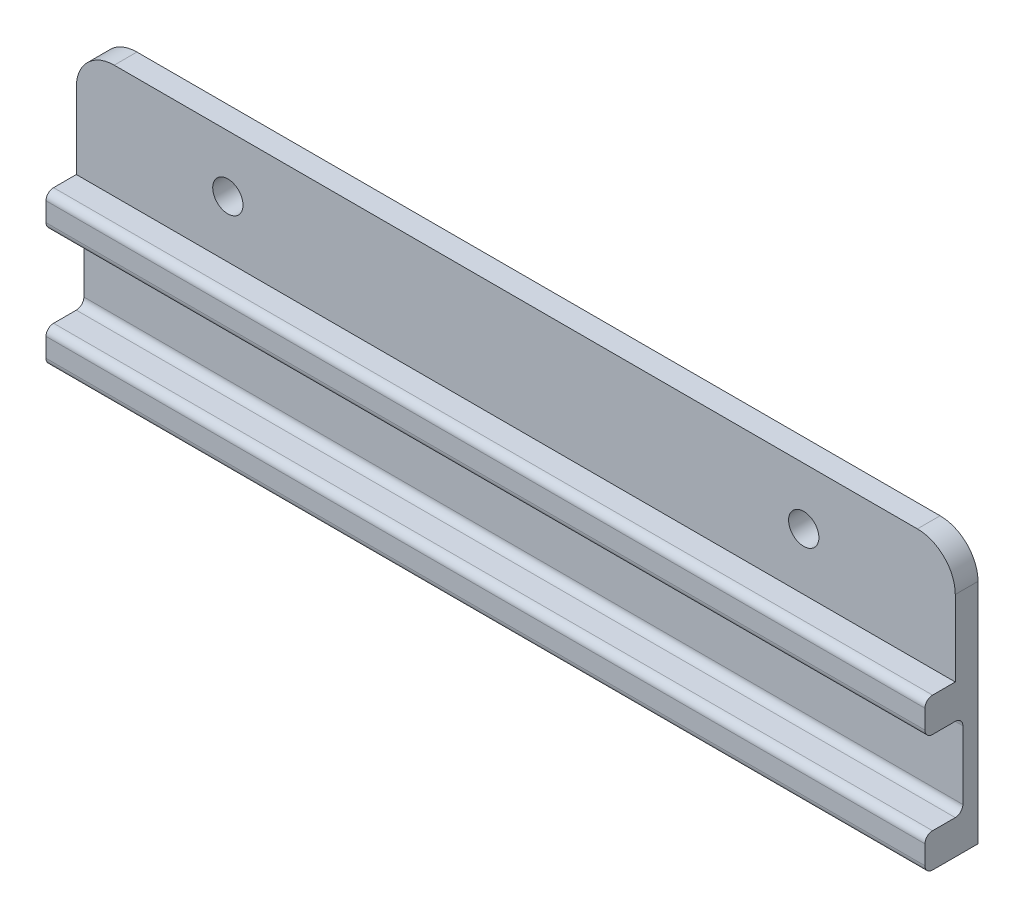
ISO-10303-21;
HEADER;
FILE_DESCRIPTION(('STEP AP214'),'2;1');
FILE_NAME('part.step','',(''),(''),'','','');
FILE_SCHEMA(('AUTOMOTIVE_DESIGN { 1 0 10303 214 1 1 1 1 }'));
ENDSEC;
DATA;
#1=APPLICATION_CONTEXT('core data for automotive mechanical design processes');
#2=APPLICATION_PROTOCOL_DEFINITION('international standard','automotive_design',2000,#1);
#3=PRODUCT_CONTEXT('',#1,'mechanical');
#4=PRODUCT('Part','Part','',(#3));
#5=PRODUCT_RELATED_PRODUCT_CATEGORY('part','',(#4));
#6=PRODUCT_DEFINITION_FORMATION('','',#4);
#7=PRODUCT_DEFINITION_CONTEXT('part definition',#1,'design');
#8=PRODUCT_DEFINITION('design','',#6,#7);
#9=PRODUCT_DEFINITION_SHAPE('','',#8);
#10=(LENGTH_UNIT() NAMED_UNIT(*) SI_UNIT(.MILLI.,.METRE.));
#11=(NAMED_UNIT(*) PLANE_ANGLE_UNIT() SI_UNIT($,.RADIAN.));
#12=(NAMED_UNIT(*) SI_UNIT($,.STERADIAN.) SOLID_ANGLE_UNIT());
#13=UNCERTAINTY_MEASURE_WITH_UNIT(LENGTH_MEASURE(1.E-05),#10,'distance_accuracy_value','');
#14=(GEOMETRIC_REPRESENTATION_CONTEXT(3) GLOBAL_UNCERTAINTY_ASSIGNED_CONTEXT((#13)) GLOBAL_UNIT_ASSIGNED_CONTEXT((#10,
#11,#12)) REPRESENTATION_CONTEXT('',''));
#15=CARTESIAN_POINT('',(0.,0.,0.));
#16=DIRECTION('',(0.,0.,1.));
#17=DIRECTION('',(1.,0.,0.));
#18=AXIS2_PLACEMENT_3D('',#15,#16,#17);
#19=CARTESIAN_POINT('',(0.,20.,2.));
#20=DIRECTION('',(0.,-1.,0.));
#21=DIRECTION('',(0.,0.,-1.));
#22=AXIS2_PLACEMENT_3D('',#19,#20,#21);
#23=PLANE('',#22);
#24=DIRECTION('',(1.,0.,0.));
#25=VECTOR('',#24,1.);
#26=CARTESIAN_POINT('',(0.,20.,3.));
#27=LINE('',#26,#25);
#28=CARTESIAN_POINT('',(0.,20.,3.));
#29=VERTEX_POINT('',#28);
#30=CARTESIAN_POINT('',(116.,20.,3.));
#31=VERTEX_POINT('',#30);
#32=EDGE_CURVE('E278',#29,#31,#27,.T.);
#33=ORIENTED_EDGE('',*,*,#32,.F.);
#34=DIRECTION('',(0.,0.,-1.));
#35=VECTOR('',#34,1.);
#36=CARTESIAN_POINT('',(0.,20.,2.));
#37=LINE('',#36,#35);
#38=CARTESIAN_POINT('',(0.,20.,6.));
#39=VERTEX_POINT('',#38);
#40=EDGE_CURVE('E194',#39,#29,#37,.T.);
#41=ORIENTED_EDGE('',*,*,#40,.F.);
#42=DIRECTION('',(-1.,0.,0.));
#43=VECTOR('',#42,1.);
#44=CARTESIAN_POINT('',(116.,20.,6.));
#45=LINE('',#44,#43);
#46=CARTESIAN_POINT('',(116.,20.,6.));
#47=VERTEX_POINT('',#46);
#48=EDGE_CURVE('E229',#39,#47,#45,.F.);
#49=ORIENTED_EDGE('',*,*,#48,.T.);
#50=DIRECTION('',(0.,0.,-1.));
#51=VECTOR('',#50,1.);
#52=CARTESIAN_POINT('',(116.,20.,2.));
#53=LINE('',#52,#51);
#54=EDGE_CURVE('E197',#47,#31,#53,.T.);
#55=ORIENTED_EDGE('',*,*,#54,.T.);
#56=EDGE_LOOP('',(#33,#41,#49,#55));
#57=FACE_BOUND('',#56,.T.);
#58=ADVANCED_FACE('F39',(#57),#23,.F.);
#59=CARTESIAN_POINT('',(0.,0.,2.));
#60=DIRECTION('',(0.,0.,-1.));
#61=DIRECTION('',(-1.,0.,0.));
#62=AXIS2_PLACEMENT_3D('',#59,#60,#61);
#63=PLANE('',#62);
#64=DIRECTION('',(0.,-1.,0.));
#65=VECTOR('',#64,1.);
#66=CARTESIAN_POINT('',(0.,0.,2.));
#67=LINE('',#66,#65);
#68=CARTESIAN_POINT('',(0.,14.5,2.));
#69=VERTEX_POINT('',#68);
#70=CARTESIAN_POINT('',(0.,5.5,2.));
#71=VERTEX_POINT('',#70);
#72=EDGE_CURVE('E190',#69,#71,#67,.T.);
#73=ORIENTED_EDGE('',*,*,#72,.T.);
#74=DIRECTION('',(-1.,0.,0.));
#75=VECTOR('',#74,1.);
#76=CARTESIAN_POINT('',(116.,5.5,2.));
#77=LINE('',#76,#75);
#78=CARTESIAN_POINT('',(116.,5.5,2.));
#79=VERTEX_POINT('',#78);
#80=EDGE_CURVE('E208',#71,#79,#77,.F.);
#81=ORIENTED_EDGE('',*,*,#80,.T.);
#82=DIRECTION('',(0.,1.,0.));
#83=VECTOR('',#82,1.);
#84=CARTESIAN_POINT('',(116.,0.,2.));
#85=LINE('',#84,#83);
#86=CARTESIAN_POINT('',(116.,14.5,2.));
#87=VERTEX_POINT('',#86);
#88=EDGE_CURVE('E198',#79,#87,#85,.T.);
#89=ORIENTED_EDGE('',*,*,#88,.T.);
#90=DIRECTION('',(1.,0.,0.));
#91=VECTOR('',#90,1.);
#92=CARTESIAN_POINT('',(0.,14.5,2.));
#93=LINE('',#92,#91);
#94=EDGE_CURVE('E206',#87,#69,#93,.F.);
#95=ORIENTED_EDGE('',*,*,#94,.T.);
#96=EDGE_LOOP('',(#73,#81,#89,#95));
#97=FACE_BOUND('',#96,.T.);
#98=ADVANCED_FACE('F315',(#97),#63,.F.);
#99=CARTESIAN_POINT('',(0.,0.,2.));
#100=DIRECTION('',(1.,0.,0.));
#101=DIRECTION('',(0.,0.,-1.));
#102=AXIS2_PLACEMENT_3D('',#99,#100,#101);
#103=PLANE('',#102);
#104=DIRECTION('',(0.,-1.,0.));
#105=VECTOR('',#104,1.);
#106=CARTESIAN_POINT('',(0.,35.,3.));
#107=LINE('',#106,#105);
#108=CARTESIAN_POINT('',(0.,30.,3.));
#109=VERTEX_POINT('',#108);
#110=EDGE_CURVE('E353',#109,#29,#107,.T.);
#111=ORIENTED_EDGE('',*,*,#110,.F.);
#112=DIRECTION('',(0.,0.,1.));
#113=VECTOR('',#112,1.);
#114=CARTESIAN_POINT('',(0.,30.,0.));
#115=LINE('',#114,#113);
#116=CARTESIAN_POINT('',(0.,30.,0.));
#117=VERTEX_POINT('',#116);
#118=EDGE_CURVE('E11',#109,#117,#115,.F.);
#119=ORIENTED_EDGE('',*,*,#118,.T.);
#120=DIRECTION('',(0.,-1.,0.));
#121=VECTOR('',#120,1.);
#122=CARTESIAN_POINT('',(0.,0.,0.));
#123=LINE('',#122,#121);
#124=CARTESIAN_POINT('',(0.,0.,0.));
#125=VERTEX_POINT('',#124);
#126=EDGE_CURVE('E164',#117,#125,#123,.T.);
#127=ORIENTED_EDGE('',*,*,#126,.T.);
#128=DIRECTION('',(0.,0.,-1.));
#129=VECTOR('',#128,1.);
#130=CARTESIAN_POINT('',(0.,0.,2.));
#131=LINE('',#130,#129);
#132=CARTESIAN_POINT('',(0.,0.,6.));
#133=VERTEX_POINT('',#132);
#134=EDGE_CURVE('E167',#133,#125,#131,.T.);
#135=ORIENTED_EDGE('',*,*,#134,.F.);
#136=CARTESIAN_POINT('',(0.,1.,6.));
#137=DIRECTION('',(1.,0.,0.));
#138=DIRECTION('',(0.,0.,-1.));
#139=AXIS2_PLACEMENT_3D('',#136,#137,#138);
#140=CIRCLE('',#139,1.);
#141=CARTESIAN_POINT('',(0.,1.,7.));
#142=VERTEX_POINT('',#141);
#143=EDGE_CURVE('E225',#133,#142,#140,.F.);
#144=ORIENTED_EDGE('',*,*,#143,.T.);
#145=DIRECTION('',(0.,-1.,0.));
#146=VECTOR('',#145,1.);
#147=CARTESIAN_POINT('',(0.,0.,7.));
#148=LINE('',#147,#146);
#149=CARTESIAN_POINT('',(0.,3.5,7.));
#150=VERTEX_POINT('',#149);
#151=EDGE_CURVE('E288',#150,#142,#148,.T.);
#152=ORIENTED_EDGE('',*,*,#151,.F.);
#153=CARTESIAN_POINT('',(0.,3.5,6.));
#154=DIRECTION('',(1.,0.,0.));
#155=DIRECTION('',(0.,0.,-1.));
#156=AXIS2_PLACEMENT_3D('',#153,#154,#155);
#157=CIRCLE('',#156,1.);
#158=CARTESIAN_POINT('',(0.,4.5,6.));
#159=VERTEX_POINT('',#158);
#160=EDGE_CURVE('E223',#150,#159,#157,.F.);
#161=ORIENTED_EDGE('',*,*,#160,.T.);
#162=DIRECTION('',(0.,0.,-1.));
#163=VECTOR('',#162,1.);
#164=CARTESIAN_POINT('',(0.,4.5,7.));
#165=LINE('',#164,#163);
#166=CARTESIAN_POINT('',(0.,4.5,3.));
#167=VERTEX_POINT('',#166);
#168=EDGE_CURVE('E299',#159,#167,#165,.T.);
#169=ORIENTED_EDGE('',*,*,#168,.T.);
#170=CARTESIAN_POINT('',(0.,5.5,3.));
#171=DIRECTION('',(1.,0.,0.));
#172=DIRECTION('',(0.,0.,-1.));
#173=AXIS2_PLACEMENT_3D('',#170,#171,#172);
#174=CIRCLE('',#173,1.);
#175=EDGE_CURVE('E246',#167,#71,#174,.T.);
#176=ORIENTED_EDGE('',*,*,#175,.T.);
#177=ORIENTED_EDGE('',*,*,#72,.F.);
#178=CARTESIAN_POINT('',(0.,14.5,3.));
#179=DIRECTION('',(1.,0.,0.));
#180=DIRECTION('',(0.,0.,-1.));
#181=AXIS2_PLACEMENT_3D('',#178,#179,#180);
#182=CIRCLE('',#181,1.);
#183=CARTESIAN_POINT('',(0.,15.5,3.));
#184=VERTEX_POINT('',#183);
#185=EDGE_CURVE('E252',#69,#184,#182,.T.);
#186=ORIENTED_EDGE('',*,*,#185,.T.);
#187=DIRECTION('',(0.,0.,-1.));
#188=VECTOR('',#187,1.);
#189=CARTESIAN_POINT('',(0.,15.5,7.));
#190=LINE('',#189,#188);
#191=CARTESIAN_POINT('',(0.,15.5,6.));
#192=VERTEX_POINT('',#191);
#193=EDGE_CURVE('E174',#192,#184,#190,.T.);
#194=ORIENTED_EDGE('',*,*,#193,.F.);
#195=CARTESIAN_POINT('',(0.,16.5,6.));
#196=DIRECTION('',(1.,0.,0.));
#197=DIRECTION('',(0.,0.,-1.));
#198=AXIS2_PLACEMENT_3D('',#195,#196,#197);
#199=CIRCLE('',#198,1.);
#200=CARTESIAN_POINT('',(0.,16.5,7.));
#201=VERTEX_POINT('',#200);
#202=EDGE_CURVE('E221',#192,#201,#199,.F.);
#203=ORIENTED_EDGE('',*,*,#202,.T.);
#204=DIRECTION('',(0.,-1.,0.));
#205=VECTOR('',#204,1.);
#206=CARTESIAN_POINT('',(0.,20.,7.));
#207=LINE('',#206,#205);
#208=CARTESIAN_POINT('',(0.,19.,7.));
#209=VERTEX_POINT('',#208);
#210=EDGE_CURVE('E293',#209,#201,#207,.T.);
#211=ORIENTED_EDGE('',*,*,#210,.F.);
#212=CARTESIAN_POINT('',(0.,19.,6.));
#213=DIRECTION('',(1.,0.,0.));
#214=DIRECTION('',(0.,0.,-1.));
#215=AXIS2_PLACEMENT_3D('',#212,#213,#214);
#216=CIRCLE('',#215,1.);
#217=EDGE_CURVE('E227',#209,#39,#216,.F.);
#218=ORIENTED_EDGE('',*,*,#217,.T.);
#219=ORIENTED_EDGE('',*,*,#40,.T.);
#220=EDGE_LOOP('',(#111,#119,#127,#135,#144,#152,#161,#169,#176,#177,#186,#194,#203,#211,#218,#219));
#221=FACE_BOUND('',#220,.T.);
#222=ADVANCED_FACE('F166',(#221),#103,.F.);
#223=CARTESIAN_POINT('',(0.,0.,2.));
#224=DIRECTION('',(0.,1.,0.));
#225=DIRECTION('',(0.,0.,1.));
#226=AXIS2_PLACEMENT_3D('',#223,#224,#225);
#227=PLANE('',#226);
#228=DIRECTION('',(0.,0.,-1.));
#229=VECTOR('',#228,1.);
#230=CARTESIAN_POINT('',(116.,0.,2.));
#231=LINE('',#230,#229);
#232=CARTESIAN_POINT('',(116.,0.,6.));
#233=VERTEX_POINT('',#232);
#234=CARTESIAN_POINT('',(116.,0.,0.));
#235=VERTEX_POINT('',#234);
#236=EDGE_CURVE('E184',#233,#235,#231,.T.);
#237=ORIENTED_EDGE('',*,*,#236,.F.);
#238=DIRECTION('',(1.,0.,0.));
#239=VECTOR('',#238,1.);
#240=CARTESIAN_POINT('',(0.,0.,6.));
#241=LINE('',#240,#239);
#242=EDGE_CURVE('E182',#233,#133,#241,.F.);
#243=ORIENTED_EDGE('',*,*,#242,.T.);
#244=ORIENTED_EDGE('',*,*,#134,.T.);
#245=DIRECTION('',(1.,0.,0.));
#246=VECTOR('',#245,1.);
#247=CARTESIAN_POINT('',(0.,0.,0.));
#248=LINE('',#247,#246);
#249=EDGE_CURVE('E173',#125,#235,#248,.T.);
#250=ORIENTED_EDGE('',*,*,#249,.T.);
#251=EDGE_LOOP('',(#237,#243,#244,#250));
#252=FACE_BOUND('',#251,.T.);
#253=ADVANCED_FACE('F179',(#252),#227,.F.);
#254=CARTESIAN_POINT('',(116.,0.,2.));
#255=DIRECTION('',(-1.,0.,0.));
#256=DIRECTION('',(0.,0.,1.));
#257=AXIS2_PLACEMENT_3D('',#254,#255,#256);
#258=PLANE('',#257);
#259=DIRECTION('',(0.,1.,0.));
#260=VECTOR('',#259,1.);
#261=CARTESIAN_POINT('',(116.,0.,0.));
#262=LINE('',#261,#260);
#263=CARTESIAN_POINT('',(116.,30.,0.));
#264=VERTEX_POINT('',#263);
#265=EDGE_CURVE('E188',#235,#264,#262,.T.);
#266=ORIENTED_EDGE('',*,*,#265,.T.);
#267=DIRECTION('',(0.,0.,-1.));
#268=VECTOR('',#267,1.);
#269=CARTESIAN_POINT('',(116.,30.,3.));
#270=LINE('',#269,#268);
#271=CARTESIAN_POINT('',(116.,30.,3.));
#272=VERTEX_POINT('',#271);
#273=EDGE_CURVE('E62',#264,#272,#270,.F.);
#274=ORIENTED_EDGE('',*,*,#273,.T.);
#275=DIRECTION('',(0.,-1.,0.));
#276=VECTOR('',#275,1.);
#277=CARTESIAN_POINT('',(116.,35.,3.));
#278=LINE('',#277,#276);
#279=EDGE_CURVE('E270',#272,#31,#278,.T.);
#280=ORIENTED_EDGE('',*,*,#279,.T.);
#281=ORIENTED_EDGE('',*,*,#54,.F.);
#282=CARTESIAN_POINT('',(116.,19.,6.));
#283=DIRECTION('',(-1.,0.,0.));
#284=DIRECTION('',(0.,0.,1.));
#285=AXIS2_PLACEMENT_3D('',#282,#283,#284);
#286=CIRCLE('',#285,1.);
#287=CARTESIAN_POINT('',(116.,19.,7.));
#288=VERTEX_POINT('',#287);
#289=EDGE_CURVE('E237',#47,#288,#286,.F.);
#290=ORIENTED_EDGE('',*,*,#289,.T.);
#291=DIRECTION('',(0.,1.,0.));
#292=VECTOR('',#291,1.);
#293=CARTESIAN_POINT('',(116.,20.,7.));
#294=LINE('',#293,#292);
#295=CARTESIAN_POINT('',(116.,16.5,7.));
#296=VERTEX_POINT('',#295);
#297=EDGE_CURVE('E297',#296,#288,#294,.T.);
#298=ORIENTED_EDGE('',*,*,#297,.F.);
#299=CARTESIAN_POINT('',(116.,16.5,6.));
#300=DIRECTION('',(-1.,0.,0.));
#301=DIRECTION('',(0.,0.,1.));
#302=AXIS2_PLACEMENT_3D('',#299,#300,#301);
#303=CIRCLE('',#302,1.);
#304=CARTESIAN_POINT('',(116.,15.5,6.));
#305=VERTEX_POINT('',#304);
#306=EDGE_CURVE('E231',#296,#305,#303,.F.);
#307=ORIENTED_EDGE('',*,*,#306,.T.);
#308=DIRECTION('',(0.,0.,-1.));
#309=VECTOR('',#308,1.);
#310=CARTESIAN_POINT('',(116.,15.5,7.));
#311=LINE('',#310,#309);
#312=CARTESIAN_POINT('',(116.,15.5,3.));
#313=VERTEX_POINT('',#312);
#314=EDGE_CURVE('E305',#305,#313,#311,.T.);
#315=ORIENTED_EDGE('',*,*,#314,.T.);
#316=CARTESIAN_POINT('',(116.,14.5,3.));
#317=DIRECTION('',(-1.,0.,0.));
#318=DIRECTION('',(0.,0.,1.));
#319=AXIS2_PLACEMENT_3D('',#316,#317,#318);
#320=CIRCLE('',#319,1.);
#321=EDGE_CURVE('E250',#313,#87,#320,.T.);
#322=ORIENTED_EDGE('',*,*,#321,.T.);
#323=ORIENTED_EDGE('',*,*,#88,.F.);
#324=CARTESIAN_POINT('',(116.,5.5,3.));
#325=DIRECTION('',(-1.,0.,0.));
#326=DIRECTION('',(0.,0.,1.));
#327=AXIS2_PLACEMENT_3D('',#324,#325,#326);
#328=CIRCLE('',#327,1.);
#329=CARTESIAN_POINT('',(116.,4.5,3.));
#330=VERTEX_POINT('',#329);
#331=EDGE_CURVE('E248',#79,#330,#328,.T.);
#332=ORIENTED_EDGE('',*,*,#331,.T.);
#333=DIRECTION('',(0.,0.,-1.));
#334=VECTOR('',#333,1.);
#335=CARTESIAN_POINT('',(116.,4.5,7.));
#336=LINE('',#335,#334);
#337=CARTESIAN_POINT('',(116.,4.5,6.));
#338=VERTEX_POINT('',#337);
#339=EDGE_CURVE('E355',#338,#330,#336,.T.);
#340=ORIENTED_EDGE('',*,*,#339,.F.);
#341=CARTESIAN_POINT('',(116.,3.5,6.));
#342=DIRECTION('',(-1.,0.,0.));
#343=DIRECTION('',(0.,0.,1.));
#344=AXIS2_PLACEMENT_3D('',#341,#342,#343);
#345=CIRCLE('',#344,1.);
#346=CARTESIAN_POINT('',(116.,3.5,7.));
#347=VERTEX_POINT('',#346);
#348=EDGE_CURVE('E233',#338,#347,#345,.F.);
#349=ORIENTED_EDGE('',*,*,#348,.T.);
#350=DIRECTION('',(0.,1.,0.));
#351=VECTOR('',#350,1.);
#352=CARTESIAN_POINT('',(116.,0.,7.));
#353=LINE('',#352,#351);
#354=CARTESIAN_POINT('',(116.,1.,7.));
#355=VERTEX_POINT('',#354);
#356=EDGE_CURVE('E294',#355,#347,#353,.T.);
#357=ORIENTED_EDGE('',*,*,#356,.F.);
#358=CARTESIAN_POINT('',(116.,1.,6.));
#359=DIRECTION('',(-1.,0.,0.));
#360=DIRECTION('',(0.,0.,1.));
#361=AXIS2_PLACEMENT_3D('',#358,#359,#360);
#362=CIRCLE('',#361,1.);
#363=EDGE_CURVE('E235',#355,#233,#362,.F.);
#364=ORIENTED_EDGE('',*,*,#363,.T.);
#365=ORIENTED_EDGE('',*,*,#236,.T.);
#366=EDGE_LOOP('',(#266,#274,#280,#281,#290,#298,#307,#315,#322,#323,#332,#340,#349,#357,#364,#365));
#367=FACE_BOUND('',#366,.T.);
#368=ADVANCED_FACE('F281',(#367),#258,.F.);
#369=CARTESIAN_POINT('',(0.,0.,0.));
#370=DIRECTION('',(0.,0.,-1.));
#371=DIRECTION('',(-1.,0.,0.));
#372=AXIS2_PLACEMENT_3D('',#369,#370,#371);
#373=PLANE('',#372);
#374=CARTESIAN_POINT('',(96.,27.5,0.));
#375=DIRECTION('',(0.,0.,-1.));
#376=DIRECTION('',(-1.,0.,0.));
#377=AXIS2_PLACEMENT_3D('',#374,#375,#376);
#378=CIRCLE('',#377,2.00000000000001);
#379=CARTESIAN_POINT('',(94.,27.5,0.));
#380=VERTEX_POINT('',#379);
#381=EDGE_CURVE('E345',#380,#380,#378,.T.);
#382=ORIENTED_EDGE('',*,*,#381,.F.);
#383=EDGE_LOOP('',(#382));
#384=FACE_BOUND('',#383,.T.);
#385=CARTESIAN_POINT('',(20.,27.5,0.));
#386=DIRECTION('',(0.,0.,-1.));
#387=DIRECTION('',(-1.,0.,0.));
#388=AXIS2_PLACEMENT_3D('',#385,#386,#387);
#389=CIRCLE('',#388,2.00000000000002);
#390=CARTESIAN_POINT('',(18.,27.5,0.));
#391=VERTEX_POINT('',#390);
#392=EDGE_CURVE('E348',#391,#391,#389,.T.);
#393=ORIENTED_EDGE('',*,*,#392,.F.);
#394=EDGE_LOOP('',(#393));
#395=FACE_BOUND('',#394,.T.);
#396=DIRECTION('',(-1.,0.,0.));
#397=VECTOR('',#396,1.);
#398=CARTESIAN_POINT('',(0.,35.,0.));
#399=LINE('',#398,#397);
#400=CARTESIAN_POINT('',(111.,35.,0.));
#401=VERTEX_POINT('',#400);
#402=CARTESIAN_POINT('',(5.,35.,0.));
#403=VERTEX_POINT('',#402);
#404=EDGE_CURVE('E277',#401,#403,#399,.T.);
#405=ORIENTED_EDGE('',*,*,#404,.F.);
#406=CARTESIAN_POINT('',(111.,30.,0.));
#407=DIRECTION('',(0.,0.,-1.));
#408=DIRECTION('',(-1.,0.,0.));
#409=AXIS2_PLACEMENT_3D('',#406,#407,#408);
#410=CIRCLE('',#409,5.);
#411=EDGE_CURVE('E262',#401,#264,#410,.T.);
#412=ORIENTED_EDGE('',*,*,#411,.T.);
#413=ORIENTED_EDGE('',*,*,#265,.F.);
#414=ORIENTED_EDGE('',*,*,#249,.F.);
#415=ORIENTED_EDGE('',*,*,#126,.F.);
#416=CARTESIAN_POINT('',(5.,30.,0.));
#417=DIRECTION('',(0.,0.,-1.));
#418=DIRECTION('',(-1.,0.,0.));
#419=AXIS2_PLACEMENT_3D('',#416,#417,#418);
#420=CIRCLE('',#419,5.);
#421=EDGE_CURVE('E260',#117,#403,#420,.T.);
#422=ORIENTED_EDGE('',*,*,#421,.T.);
#423=EDGE_LOOP('',(#405,#412,#413,#414,#415,#422));
#424=FACE_BOUND('',#423,.T.);
#425=ADVANCED_FACE('F187',(#384,#395,#424),#373,.T.);
#426=CARTESIAN_POINT('',(0.,15.5,7.));
#427=DIRECTION('',(0.,1.,0.));
#428=DIRECTION('',(0.,0.,1.));
#429=AXIS2_PLACEMENT_3D('',#426,#427,#428);
#430=PLANE('',#429);
#431=ORIENTED_EDGE('',*,*,#193,.T.);
#432=DIRECTION('',(1.,0.,0.));
#433=VECTOR('',#432,1.);
#434=CARTESIAN_POINT('',(116.,15.5,3.));
#435=LINE('',#434,#433);
#436=EDGE_CURVE('E212',#184,#313,#435,.T.);
#437=ORIENTED_EDGE('',*,*,#436,.T.);
#438=ORIENTED_EDGE('',*,*,#314,.F.);
#439=DIRECTION('',(1.,0.,0.));
#440=VECTOR('',#439,1.);
#441=CARTESIAN_POINT('',(0.,15.5,6.));
#442=LINE('',#441,#440);
#443=EDGE_CURVE('E210',#305,#192,#442,.F.);
#444=ORIENTED_EDGE('',*,*,#443,.T.);
#445=EDGE_LOOP('',(#431,#437,#438,#444));
#446=FACE_BOUND('',#445,.T.);
#447=ADVANCED_FACE('F326',(#446),#430,.F.);
#448=CARTESIAN_POINT('',(0.,0.,7.));
#449=DIRECTION('',(0.,0.,1.));
#450=DIRECTION('',(1.,0.,0.));
#451=AXIS2_PLACEMENT_3D('',#448,#449,#450);
#452=PLANE('',#451);
#453=ORIENTED_EDGE('',*,*,#297,.T.);
#454=DIRECTION('',(-1.,0.,0.));
#455=VECTOR('',#454,1.);
#456=CARTESIAN_POINT('',(0.,19.,7.));
#457=LINE('',#456,#455);
#458=EDGE_CURVE('E218',#288,#209,#457,.T.);
#459=ORIENTED_EDGE('',*,*,#458,.T.);
#460=ORIENTED_EDGE('',*,*,#210,.T.);
#461=DIRECTION('',(1.,0.,0.));
#462=VECTOR('',#461,1.);
#463=CARTESIAN_POINT('',(116.,16.5,7.));
#464=LINE('',#463,#462);
#465=EDGE_CURVE('E215',#201,#296,#464,.T.);
#466=ORIENTED_EDGE('',*,*,#465,.T.);
#467=EDGE_LOOP('',(#453,#459,#460,#466));
#468=FACE_BOUND('',#467,.T.);
#469=ADVANCED_FACE('F334',(#468),#452,.T.);
#470=CARTESIAN_POINT('',(0.,4.5,7.));
#471=DIRECTION('',(0.,-1.,0.));
#472=DIRECTION('',(0.,0.,-1.));
#473=AXIS2_PLACEMENT_3D('',#470,#471,#472);
#474=PLANE('',#473);
#475=ORIENTED_EDGE('',*,*,#339,.T.);
#476=DIRECTION('',(-1.,0.,0.));
#477=VECTOR('',#476,1.);
#478=CARTESIAN_POINT('',(0.,4.5,3.));
#479=LINE('',#478,#477);
#480=EDGE_CURVE('E203',#330,#167,#479,.T.);
#481=ORIENTED_EDGE('',*,*,#480,.T.);
#482=ORIENTED_EDGE('',*,*,#168,.F.);
#483=DIRECTION('',(-1.,0.,0.));
#484=VECTOR('',#483,1.);
#485=CARTESIAN_POINT('',(0.,4.5,6.));
#486=LINE('',#485,#484);
#487=EDGE_CURVE('E183',#159,#338,#486,.F.);
#488=ORIENTED_EDGE('',*,*,#487,.T.);
#489=EDGE_LOOP('',(#475,#481,#482,#488));
#490=FACE_BOUND('',#489,.T.);
#491=ADVANCED_FACE('F361',(#490),#474,.F.);
#492=CARTESIAN_POINT('',(0.,0.,7.));
#493=DIRECTION('',(0.,0.,-1.));
#494=DIRECTION('',(-1.,0.,0.));
#495=AXIS2_PLACEMENT_3D('',#492,#493,#494);
#496=PLANE('',#495);
#497=ORIENTED_EDGE('',*,*,#151,.T.);
#498=DIRECTION('',(1.,0.,0.));
#499=VECTOR('',#498,1.);
#500=CARTESIAN_POINT('',(0.,1.,7.));
#501=LINE('',#500,#499);
#502=EDGE_CURVE('E242',#142,#355,#501,.T.);
#503=ORIENTED_EDGE('',*,*,#502,.T.);
#504=ORIENTED_EDGE('',*,*,#356,.T.);
#505=DIRECTION('',(-1.,0.,0.));
#506=VECTOR('',#505,1.);
#507=CARTESIAN_POINT('',(0.,3.5,7.));
#508=LINE('',#507,#506);
#509=EDGE_CURVE('E239',#347,#150,#508,.T.);
#510=ORIENTED_EDGE('',*,*,#509,.T.);
#511=EDGE_LOOP('',(#497,#503,#504,#510));
#512=FACE_BOUND('',#511,.T.);
#513=ADVANCED_FACE('F290',(#512),#496,.F.);
#514=CARTESIAN_POINT('',(0.,5.5,3.));
#515=DIRECTION('',(1.,0.,0.));
#516=DIRECTION('',(0.,0.,-1.));
#517=AXIS2_PLACEMENT_3D('',#514,#515,#516);
#518=CYLINDRICAL_SURFACE('',#517,1.);
#519=ORIENTED_EDGE('',*,*,#331,.F.);
#520=ORIENTED_EDGE('',*,*,#80,.F.);
#521=ORIENTED_EDGE('',*,*,#175,.F.);
#522=ORIENTED_EDGE('',*,*,#480,.F.);
#523=EDGE_LOOP('',(#519,#520,#521,#522));
#524=FACE_BOUND('',#523,.T.);
#525=ADVANCED_FACE('F368',(#524),#518,.F.);
#526=CARTESIAN_POINT('',(0.,14.5,3.));
#527=DIRECTION('',(-1.,0.,0.));
#528=DIRECTION('',(0.,0.,1.));
#529=AXIS2_PLACEMENT_3D('',#526,#527,#528);
#530=CYLINDRICAL_SURFACE('',#529,1.);
#531=ORIENTED_EDGE('',*,*,#185,.F.);
#532=ORIENTED_EDGE('',*,*,#94,.F.);
#533=ORIENTED_EDGE('',*,*,#321,.F.);
#534=ORIENTED_EDGE('',*,*,#436,.F.);
#535=EDGE_LOOP('',(#531,#532,#533,#534));
#536=FACE_BOUND('',#535,.T.);
#537=ADVANCED_FACE('F321',(#536),#530,.F.);
#538=CARTESIAN_POINT('',(0.,19.,6.));
#539=DIRECTION('',(1.,0.,0.));
#540=DIRECTION('',(0.,0.,-1.));
#541=AXIS2_PLACEMENT_3D('',#538,#539,#540);
#542=CYLINDRICAL_SURFACE('',#541,1.);
#543=ORIENTED_EDGE('',*,*,#289,.F.);
#544=ORIENTED_EDGE('',*,*,#48,.F.);
#545=ORIENTED_EDGE('',*,*,#217,.F.);
#546=ORIENTED_EDGE('',*,*,#458,.F.);
#547=EDGE_LOOP('',(#543,#544,#545,#546));
#548=FACE_BOUND('',#547,.T.);
#549=ADVANCED_FACE('F339',(#548),#542,.T.);
#550=CARTESIAN_POINT('',(0.,1.,6.));
#551=DIRECTION('',(1.,0.,0.));
#552=DIRECTION('',(0.,0.,-1.));
#553=AXIS2_PLACEMENT_3D('',#550,#551,#552);
#554=CYLINDRICAL_SURFACE('',#553,1.);
#555=ORIENTED_EDGE('',*,*,#143,.F.);
#556=ORIENTED_EDGE('',*,*,#242,.F.);
#557=ORIENTED_EDGE('',*,*,#363,.F.);
#558=ORIENTED_EDGE('',*,*,#502,.F.);
#559=EDGE_LOOP('',(#555,#556,#557,#558));
#560=FACE_BOUND('',#559,.T.);
#561=ADVANCED_FACE('F284',(#560),#554,.T.);
#562=CARTESIAN_POINT('',(0.,3.5,6.));
#563=DIRECTION('',(-1.,0.,0.));
#564=DIRECTION('',(0.,0.,1.));
#565=AXIS2_PLACEMENT_3D('',#562,#563,#564);
#566=CYLINDRICAL_SURFACE('',#565,1.);
#567=ORIENTED_EDGE('',*,*,#348,.F.);
#568=ORIENTED_EDGE('',*,*,#487,.F.);
#569=ORIENTED_EDGE('',*,*,#160,.F.);
#570=ORIENTED_EDGE('',*,*,#509,.F.);
#571=EDGE_LOOP('',(#567,#568,#569,#570));
#572=FACE_BOUND('',#571,.T.);
#573=ADVANCED_FACE('F366',(#572),#566,.T.);
#574=CARTESIAN_POINT('',(0.,16.5,6.));
#575=DIRECTION('',(-1.,0.,0.));
#576=DIRECTION('',(0.,0.,1.));
#577=AXIS2_PLACEMENT_3D('',#574,#575,#576);
#578=CYLINDRICAL_SURFACE('',#577,1.);
#579=ORIENTED_EDGE('',*,*,#202,.F.);
#580=ORIENTED_EDGE('',*,*,#443,.F.);
#581=ORIENTED_EDGE('',*,*,#306,.F.);
#582=ORIENTED_EDGE('',*,*,#465,.F.);
#583=EDGE_LOOP('',(#579,#580,#581,#582));
#584=FACE_BOUND('',#583,.T.);
#585=ADVANCED_FACE('F330',(#584),#578,.T.);
#586=CARTESIAN_POINT('',(0.,35.,3.));
#587=DIRECTION('',(0.,0.,-1.));
#588=DIRECTION('',(-1.,0.,0.));
#589=AXIS2_PLACEMENT_3D('',#586,#587,#588);
#590=PLANE('',#589);
#591=CARTESIAN_POINT('',(96.,27.5,3.));
#592=DIRECTION('',(0.,0.,1.));
#593=DIRECTION('',(1.,0.,0.));
#594=AXIS2_PLACEMENT_3D('',#591,#592,#593);
#595=CIRCLE('',#594,2.00000000000001);
#596=CARTESIAN_POINT('',(98.,27.5,3.));
#597=VERTEX_POINT('',#596);
#598=EDGE_CURVE('E581',#597,#597,#595,.T.);
#599=ORIENTED_EDGE('',*,*,#598,.F.);
#600=EDGE_LOOP('',(#599));
#601=FACE_BOUND('',#600,.T.);
#602=CARTESIAN_POINT('',(20.,27.5,3.));
#603=DIRECTION('',(0.,0.,1.));
#604=DIRECTION('',(-1.,0.,0.));
#605=AXIS2_PLACEMENT_3D('',#602,#603,#604);
#606=CIRCLE('',#605,2.00000000000002);
#607=CARTESIAN_POINT('',(18.,27.5,3.));
#608=VERTEX_POINT('',#607);
#609=EDGE_CURVE('E582',#608,#608,#606,.T.);
#610=ORIENTED_EDGE('',*,*,#609,.F.);
#611=EDGE_LOOP('',(#610));
#612=FACE_BOUND('',#611,.T.);
#613=ORIENTED_EDGE('',*,*,#279,.F.);
#614=CARTESIAN_POINT('',(111.,30.,3.));
#615=DIRECTION('',(0.,0.,-1.));
#616=DIRECTION('',(-1.,0.,0.));
#617=AXIS2_PLACEMENT_3D('',#614,#615,#616);
#618=CIRCLE('',#617,5.);
#619=CARTESIAN_POINT('',(111.,35.,3.));
#620=VERTEX_POINT('',#619);
#621=EDGE_CURVE('E47',#272,#620,#618,.F.);
#622=ORIENTED_EDGE('',*,*,#621,.T.);
#623=DIRECTION('',(1.,0.,0.));
#624=VECTOR('',#623,1.);
#625=CARTESIAN_POINT('',(0.,35.,3.));
#626=LINE('',#625,#624);
#627=CARTESIAN_POINT('',(5.,35.,3.));
#628=VERTEX_POINT('',#627);
#629=EDGE_CURVE('E268',#628,#620,#626,.T.);
#630=ORIENTED_EDGE('',*,*,#629,.F.);
#631=CARTESIAN_POINT('',(5.,30.,3.));
#632=DIRECTION('',(0.,0.,-1.));
#633=DIRECTION('',(-1.,0.,0.));
#634=AXIS2_PLACEMENT_3D('',#631,#632,#633);
#635=CIRCLE('',#634,5.);
#636=EDGE_CURVE('E54',#628,#109,#635,.F.);
#637=ORIENTED_EDGE('',*,*,#636,.T.);
#638=ORIENTED_EDGE('',*,*,#110,.T.);
#639=ORIENTED_EDGE('',*,*,#32,.T.);
#640=EDGE_LOOP('',(#613,#622,#630,#637,#638,#639));
#641=FACE_BOUND('',#640,.T.);
#642=ADVANCED_FACE('F267',(#601,#612,#641),#590,.F.);
#643=CARTESIAN_POINT('',(0.,35.,0.));
#644=DIRECTION('',(0.,1.,0.));
#645=DIRECTION('',(0.,0.,1.));
#646=AXIS2_PLACEMENT_3D('',#643,#644,#645);
#647=PLANE('',#646);
#648=ORIENTED_EDGE('',*,*,#629,.T.);
#649=DIRECTION('',(0.,0.,-1.));
#650=VECTOR('',#649,1.);
#651=CARTESIAN_POINT('',(111.,35.,0.));
#652=LINE('',#651,#650);
#653=EDGE_CURVE('E257',#620,#401,#652,.T.);
#654=ORIENTED_EDGE('',*,*,#653,.T.);
#655=ORIENTED_EDGE('',*,*,#404,.T.);
#656=DIRECTION('',(0.,0.,1.));
#657=VECTOR('',#656,1.);
#658=CARTESIAN_POINT('',(5.,35.,3.));
#659=LINE('',#658,#657);
#660=EDGE_CURVE('E254',#403,#628,#659,.T.);
#661=ORIENTED_EDGE('',*,*,#660,.T.);
#662=EDGE_LOOP('',(#648,#654,#655,#661));
#663=FACE_BOUND('',#662,.T.);
#664=ADVANCED_FACE('F274',(#663),#647,.T.);
#665=CARTESIAN_POINT('',(111.,30.,0.));
#666=DIRECTION('',(0.,0.,1.));
#667=DIRECTION('',(1.,0.,0.));
#668=AXIS2_PLACEMENT_3D('',#665,#666,#667);
#669=CYLINDRICAL_SURFACE('',#668,5.);
#670=ORIENTED_EDGE('',*,*,#621,.F.);
#671=ORIENTED_EDGE('',*,*,#273,.F.);
#672=ORIENTED_EDGE('',*,*,#411,.F.);
#673=ORIENTED_EDGE('',*,*,#653,.F.);
#674=EDGE_LOOP('',(#670,#671,#672,#673));
#675=FACE_BOUND('',#674,.T.);
#676=ADVANCED_FACE('F280',(#675),#669,.T.);
#677=CARTESIAN_POINT('',(5.,30.,0.));
#678=DIRECTION('',(0.,0.,-1.));
#679=DIRECTION('',(-1.,0.,0.));
#680=AXIS2_PLACEMENT_3D('',#677,#678,#679);
#681=CYLINDRICAL_SURFACE('',#680,5.);
#682=ORIENTED_EDGE('',*,*,#421,.F.);
#683=ORIENTED_EDGE('',*,*,#118,.F.);
#684=ORIENTED_EDGE('',*,*,#636,.F.);
#685=ORIENTED_EDGE('',*,*,#660,.F.);
#686=EDGE_LOOP('',(#682,#683,#684,#685));
#687=FACE_BOUND('',#686,.T.);
#688=ADVANCED_FACE('F41',(#687),#681,.T.);
#689=CARTESIAN_POINT('',(20.,27.5,-12.));
#690=DIRECTION('',(0.,0.,1.));
#691=DIRECTION('',(1.,0.,0.));
#692=AXIS2_PLACEMENT_3D('',#689,#690,#691);
#693=CYLINDRICAL_SURFACE('',#692,2.00000000000002);
#694=ORIENTED_EDGE('',*,*,#392,.T.);
#695=EDGE_LOOP('',(#694));
#696=FACE_BOUND('',#695,.T.);
#697=ORIENTED_EDGE('',*,*,#609,.T.);
#698=EDGE_LOOP('',(#697));
#699=FACE_BOUND('',#698,.T.);
#700=ADVANCED_FACE('F421',(#696,#699),#693,.F.);
#701=CARTESIAN_POINT('',(96.,27.5,-12.));
#702=DIRECTION('',(0.,0.,1.));
#703=DIRECTION('',(1.,0.,0.));
#704=AXIS2_PLACEMENT_3D('',#701,#702,#703);
#705=CYLINDRICAL_SURFACE('',#704,2.00000000000001);
#706=ORIENTED_EDGE('',*,*,#381,.T.);
#707=EDGE_LOOP('',(#706));
#708=FACE_BOUND('',#707,.T.);
#709=ORIENTED_EDGE('',*,*,#598,.T.);
#710=EDGE_LOOP('',(#709));
#711=FACE_BOUND('',#710,.T.);
#712=ADVANCED_FACE('F442',(#708,#711),#705,.F.);
#713=CLOSED_SHELL('',(#58,#98,#222,#253,#368,#425,#447,#469,#491,#513,#525,#537,#549,#561,#573,
#585,#642,#664,#676,#688,#700,#712));
#714=MANIFOLD_SOLID_BREP('B2',#713);
#715=ADVANCED_BREP_SHAPE_REPRESENTATION('',(#18,#714),#14);
#716=SHAPE_DEFINITION_REPRESENTATION(#9,#715);
ENDSEC;
END-ISO-10303-21;
